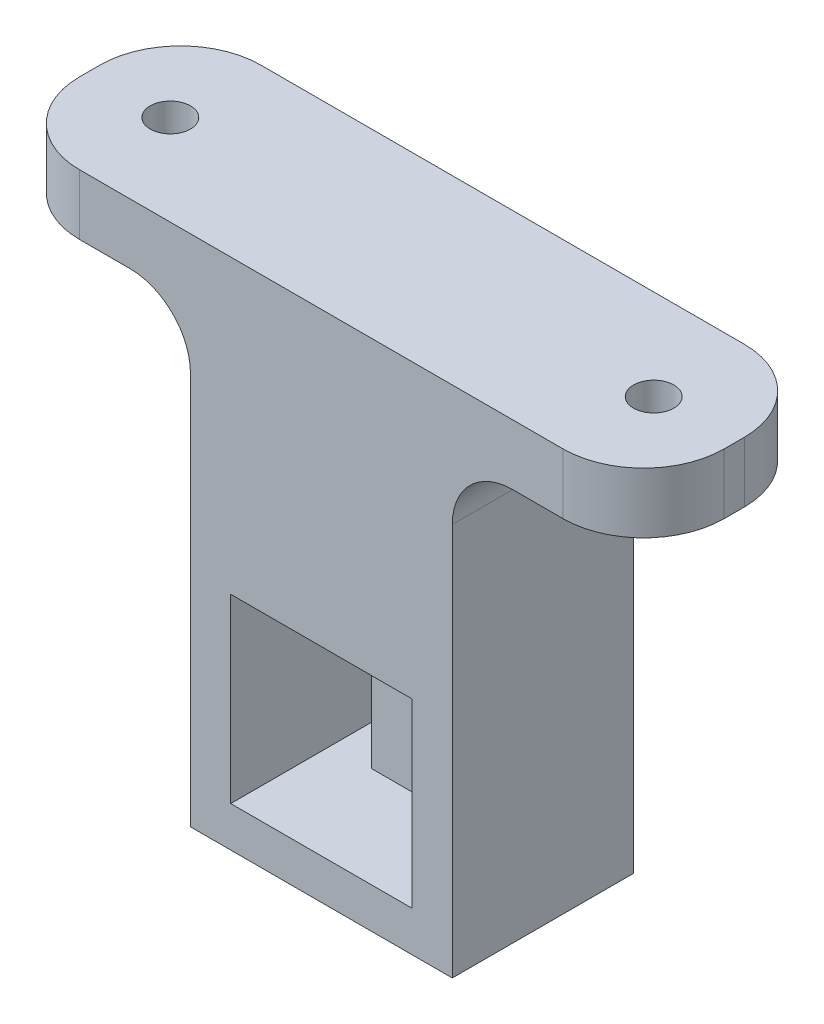
ISO-10303-21;
HEADER;
FILE_DESCRIPTION(('STEP AP214'),'2;1');
FILE_NAME('part.step','',(''),(''),'','','');
FILE_SCHEMA(('AUTOMOTIVE_DESIGN { 1 0 10303 214 1 1 1 1 }'));
ENDSEC;
DATA;
#1=APPLICATION_CONTEXT('core data for automotive mechanical design processes');
#2=APPLICATION_PROTOCOL_DEFINITION('international standard','automotive_design',2000,#1);
#3=PRODUCT_CONTEXT('',#1,'mechanical');
#4=PRODUCT('Part','Part','',(#3));
#5=PRODUCT_RELATED_PRODUCT_CATEGORY('part','',(#4));
#6=PRODUCT_DEFINITION_FORMATION('','',#4);
#7=PRODUCT_DEFINITION_CONTEXT('part definition',#1,'design');
#8=PRODUCT_DEFINITION('design','',#6,#7);
#9=PRODUCT_DEFINITION_SHAPE('','',#8);
#10=(LENGTH_UNIT() NAMED_UNIT(*) SI_UNIT(.MILLI.,.METRE.));
#11=(NAMED_UNIT(*) PLANE_ANGLE_UNIT() SI_UNIT($,.RADIAN.));
#12=(NAMED_UNIT(*) SI_UNIT($,.STERADIAN.) SOLID_ANGLE_UNIT());
#13=UNCERTAINTY_MEASURE_WITH_UNIT(LENGTH_MEASURE(1.E-05),#10,'distance_accuracy_value','');
#14=(GEOMETRIC_REPRESENTATION_CONTEXT(3) GLOBAL_UNCERTAINTY_ASSIGNED_CONTEXT((#13)) GLOBAL_UNIT_ASSIGNED_CONTEXT((#10,
#11,#12)) REPRESENTATION_CONTEXT('',''));
#15=CARTESIAN_POINT('',(0.,0.,0.));
#16=DIRECTION('',(0.,0.,1.));
#17=DIRECTION('',(1.,0.,0.));
#18=AXIS2_PLACEMENT_3D('',#15,#16,#17);
#19=CARTESIAN_POINT('',(-6.5,0.,-34.));
#20=DIRECTION('',(1.,0.,0.));
#21=DIRECTION('',(0.,1.,0.));
#22=AXIS2_PLACEMENT_3D('',#19,#20,#21);
#23=PLANE('',#22);
#24=DIRECTION('',(0.,-1.,0.));
#25=VECTOR('',#24,1.);
#26=CARTESIAN_POINT('',(-6.5,12.5,-25.));
#27=LINE('',#26,#25);
#28=CARTESIAN_POINT('',(-6.5,19.,-25.));
#29=VERTEX_POINT('',#28);
#30=CARTESIAN_POINT('',(-6.5,-0.499999999999999,-25.));
#31=VERTEX_POINT('',#30);
#32=EDGE_CURVE('E280',#29,#31,#27,.T.);
#33=ORIENTED_EDGE('',*,*,#32,.F.);
#34=DIRECTION('',(0.,0.,-1.));
#35=VECTOR('',#34,1.);
#36=CARTESIAN_POINT('',(-6.5,19.,-34.));
#37=LINE('',#36,#35);
#38=CARTESIAN_POINT('',(-6.5,19.,-34.));
#39=VERTEX_POINT('',#38);
#40=EDGE_CURVE('E349',#29,#39,#37,.T.);
#41=ORIENTED_EDGE('',*,*,#40,.T.);
#42=DIRECTION('',(0.,1.,0.));
#43=VECTOR('',#42,1.);
#44=CARTESIAN_POINT('',(-6.5,0.,-34.));
#45=LINE('',#44,#43);
#46=CARTESIAN_POINT('',(-6.5,-0.499999999999999,-34.));
#47=VERTEX_POINT('',#46);
#48=EDGE_CURVE('E315',#47,#39,#45,.T.);
#49=ORIENTED_EDGE('',*,*,#48,.F.);
#50=DIRECTION('',(0.,0.,1.));
#51=VECTOR('',#50,1.);
#52=CARTESIAN_POINT('',(-6.5,-0.499999999999999,-34.));
#53=LINE('',#52,#51);
#54=EDGE_CURVE('E325',#47,#31,#53,.T.);
#55=ORIENTED_EDGE('',*,*,#54,.T.);
#56=EDGE_LOOP('',(#33,#41,#49,#55));
#57=FACE_BOUND('',#56,.T.);
#58=ADVANCED_FACE('F37',(#57),#23,.F.);
#59=CARTESIAN_POINT('',(6.5,0.,-34.));
#60=DIRECTION('',(-1.,0.,0.));
#61=DIRECTION('',(0.,-1.,0.));
#62=AXIS2_PLACEMENT_3D('',#59,#60,#61);
#63=PLANE('',#62);
#64=DIRECTION('',(0.,-1.,0.));
#65=VECTOR('',#64,1.);
#66=CARTESIAN_POINT('',(6.5,0.,-34.));
#67=LINE('',#66,#65);
#68=CARTESIAN_POINT('',(6.5,19.,-34.));
#69=VERTEX_POINT('',#68);
#70=CARTESIAN_POINT('',(6.5,-0.499999999999999,-34.));
#71=VERTEX_POINT('',#70);
#72=EDGE_CURVE('E317',#69,#71,#67,.T.);
#73=ORIENTED_EDGE('',*,*,#72,.F.);
#74=DIRECTION('',(0.,0.,1.));
#75=VECTOR('',#74,1.);
#76=CARTESIAN_POINT('',(6.5,19.,-34.));
#77=LINE('',#76,#75);
#78=CARTESIAN_POINT('',(6.5,19.,-25.));
#79=VERTEX_POINT('',#78);
#80=EDGE_CURVE('E283',#69,#79,#77,.T.);
#81=ORIENTED_EDGE('',*,*,#80,.T.);
#82=DIRECTION('',(0.,1.,0.));
#83=VECTOR('',#82,1.);
#84=CARTESIAN_POINT('',(6.5,-0.499999999999999,-25.));
#85=LINE('',#84,#83);
#86=CARTESIAN_POINT('',(6.5,-0.499999999999999,-25.));
#87=VERTEX_POINT('',#86);
#88=EDGE_CURVE('E292',#87,#79,#85,.T.);
#89=ORIENTED_EDGE('',*,*,#88,.F.);
#90=DIRECTION('',(0.,0.,1.));
#91=VECTOR('',#90,1.);
#92=CARTESIAN_POINT('',(6.5,-0.499999999999999,-34.));
#93=LINE('',#92,#91);
#94=EDGE_CURVE('E287',#71,#87,#93,.T.);
#95=ORIENTED_EDGE('',*,*,#94,.F.);
#96=EDGE_LOOP('',(#73,#81,#89,#95));
#97=FACE_BOUND('',#96,.T.);
#98=ADVANCED_FACE('F361',(#97),#63,.F.);
#99=CARTESIAN_POINT('',(-2.5,0.,-34.));
#100=DIRECTION('',(1.,0.,0.));
#101=DIRECTION('',(0.,1.,0.));
#102=AXIS2_PLACEMENT_3D('',#99,#100,#101);
#103=PLANE('',#102);
#104=DIRECTION('',(0.,1.,0.));
#105=VECTOR('',#104,1.);
#106=CARTESIAN_POINT('',(-2.5,0.,-30.));
#107=LINE('',#106,#105);
#108=CARTESIAN_POINT('',(-2.5,1.5,-30.));
#109=VERTEX_POINT('',#108);
#110=CARTESIAN_POINT('',(-2.5,10.5,-30.));
#111=VERTEX_POINT('',#110);
#112=EDGE_CURVE('E300',#109,#111,#107,.T.);
#113=ORIENTED_EDGE('',*,*,#112,.T.);
#114=DIRECTION('',(0.,0.,1.));
#115=VECTOR('',#114,1.);
#116=CARTESIAN_POINT('',(-2.5,10.5,-34.));
#117=LINE('',#116,#115);
#118=CARTESIAN_POINT('',(-2.5,10.5,-34.));
#119=VERTEX_POINT('',#118);
#120=EDGE_CURVE('E328',#119,#111,#117,.T.);
#121=ORIENTED_EDGE('',*,*,#120,.F.);
#122=DIRECTION('',(0.,1.,0.));
#123=VECTOR('',#122,1.);
#124=CARTESIAN_POINT('',(-2.5,0.,-34.));
#125=LINE('',#124,#123);
#126=CARTESIAN_POINT('',(-2.5,1.5,-34.));
#127=VERTEX_POINT('',#126);
#128=EDGE_CURVE('E310',#127,#119,#125,.T.);
#129=ORIENTED_EDGE('',*,*,#128,.F.);
#130=DIRECTION('',(0.,0.,1.));
#131=VECTOR('',#130,1.);
#132=CARTESIAN_POINT('',(-2.5,1.5,-34.));
#133=LINE('',#132,#131);
#134=EDGE_CURVE('E330',#127,#109,#133,.T.);
#135=ORIENTED_EDGE('',*,*,#134,.T.);
#136=EDGE_LOOP('',(#113,#121,#129,#135));
#137=FACE_BOUND('',#136,.T.);
#138=ADVANCED_FACE('F415',(#137),#103,.F.);
#139=CARTESIAN_POINT('',(0.,10.5,-34.));
#140=DIRECTION('',(0.,-1.,0.));
#141=DIRECTION('',(0.,0.,-1.));
#142=AXIS2_PLACEMENT_3D('',#139,#140,#141);
#143=PLANE('',#142);
#144=ORIENTED_EDGE('',*,*,#120,.T.);
#145=DIRECTION('',(-1.,0.,0.));
#146=VECTOR('',#145,1.);
#147=CARTESIAN_POINT('',(4.5,10.5,-30.));
#148=LINE('',#147,#146);
#149=CARTESIAN_POINT('',(2.5,10.5,-30.));
#150=VERTEX_POINT('',#149);
#151=EDGE_CURVE('E281',#150,#111,#148,.T.);
#152=ORIENTED_EDGE('',*,*,#151,.F.);
#153=DIRECTION('',(0.,0.,1.));
#154=VECTOR('',#153,1.);
#155=CARTESIAN_POINT('',(2.5,10.5,-34.));
#156=LINE('',#155,#154);
#157=CARTESIAN_POINT('',(2.5,10.5,-34.));
#158=VERTEX_POINT('',#157);
#159=EDGE_CURVE('E333',#158,#150,#156,.T.);
#160=ORIENTED_EDGE('',*,*,#159,.F.);
#161=DIRECTION('',(1.,0.,0.));
#162=VECTOR('',#161,1.);
#163=CARTESIAN_POINT('',(0.,10.5,-34.));
#164=LINE('',#163,#162);
#165=CARTESIAN_POINT('',(4.5,10.5,-34.));
#166=VERTEX_POINT('',#165);
#167=EDGE_CURVE('E296',#158,#166,#164,.T.);
#168=ORIENTED_EDGE('',*,*,#167,.T.);
#169=DIRECTION('',(0.,0.,1.));
#170=VECTOR('',#169,1.);
#171=CARTESIAN_POINT('',(4.5,10.5,-34.));
#172=LINE('',#171,#170);
#173=CARTESIAN_POINT('',(4.5,10.5,-25.));
#174=VERTEX_POINT('',#173);
#175=EDGE_CURVE('E321',#166,#174,#172,.T.);
#176=ORIENTED_EDGE('',*,*,#175,.T.);
#177=DIRECTION('',(-1.,0.,0.));
#178=VECTOR('',#177,1.);
#179=CARTESIAN_POINT('',(4.5,10.5,-25.));
#180=LINE('',#179,#178);
#181=CARTESIAN_POINT('',(-4.5,10.5,-25.));
#182=VERTEX_POINT('',#181);
#183=EDGE_CURVE('E268',#174,#182,#180,.T.);
#184=ORIENTED_EDGE('',*,*,#183,.T.);
#185=DIRECTION('',(0.,0.,1.));
#186=VECTOR('',#185,1.);
#187=CARTESIAN_POINT('',(-4.5,10.5,-34.));
#188=LINE('',#187,#186);
#189=CARTESIAN_POINT('',(-4.5,10.5,-34.));
#190=VERTEX_POINT('',#189);
#191=EDGE_CURVE('E335',#190,#182,#188,.T.);
#192=ORIENTED_EDGE('',*,*,#191,.F.);
#193=EDGE_CURVE('E301',#190,#119,#164,.T.);
#194=ORIENTED_EDGE('',*,*,#193,.T.);
#195=EDGE_LOOP('',(#144,#152,#160,#168,#176,#184,#192,#194));
#196=FACE_BOUND('',#195,.T.);
#197=ADVANCED_FACE('F424',(#196),#143,.T.);
#198=CARTESIAN_POINT('',(-4.5,0.,-34.));
#199=DIRECTION('',(1.,0.,0.));
#200=DIRECTION('',(0.,0.,-1.));
#201=AXIS2_PLACEMENT_3D('',#198,#199,#200);
#202=PLANE('',#201);
#203=ORIENTED_EDGE('',*,*,#191,.T.);
#204=DIRECTION('',(0.,-1.,0.));
#205=VECTOR('',#204,1.);
#206=CARTESIAN_POINT('',(-4.5,10.5,-25.));
#207=LINE('',#206,#205);
#208=CARTESIAN_POINT('',(-4.5,1.5,-25.));
#209=VERTEX_POINT('',#208);
#210=EDGE_CURVE('E271',#182,#209,#207,.T.);
#211=ORIENTED_EDGE('',*,*,#210,.T.);
#212=DIRECTION('',(0.,0.,1.));
#213=VECTOR('',#212,1.);
#214=CARTESIAN_POINT('',(-4.5,1.5,-34.));
#215=LINE('',#214,#213);
#216=CARTESIAN_POINT('',(-4.5,1.5,-34.));
#217=VERTEX_POINT('',#216);
#218=EDGE_CURVE('E332',#217,#209,#215,.T.);
#219=ORIENTED_EDGE('',*,*,#218,.F.);
#220=DIRECTION('',(0.,1.,0.));
#221=VECTOR('',#220,1.);
#222=CARTESIAN_POINT('',(-4.5,0.,-34.));
#223=LINE('',#222,#221);
#224=EDGE_CURVE('E312',#217,#190,#223,.T.);
#225=ORIENTED_EDGE('',*,*,#224,.T.);
#226=EDGE_LOOP('',(#203,#211,#219,#225));
#227=FACE_BOUND('',#226,.T.);
#228=ADVANCED_FACE('F421',(#227),#202,.T.);
#229=CARTESIAN_POINT('',(2.5,0.,-34.));
#230=DIRECTION('',(-1.,0.,0.));
#231=DIRECTION('',(0.,-1.,0.));
#232=AXIS2_PLACEMENT_3D('',#229,#230,#231);
#233=PLANE('',#232);
#234=DIRECTION('',(0.,-1.,0.));
#235=VECTOR('',#234,1.);
#236=CARTESIAN_POINT('',(2.5,0.,-30.));
#237=LINE('',#236,#235);
#238=CARTESIAN_POINT('',(2.5,1.5,-30.));
#239=VERTEX_POINT('',#238);
#240=EDGE_CURVE('E295',#150,#239,#237,.T.);
#241=ORIENTED_EDGE('',*,*,#240,.T.);
#242=DIRECTION('',(0.,0.,1.));
#243=VECTOR('',#242,1.);
#244=CARTESIAN_POINT('',(2.5,1.5,-34.));
#245=LINE('',#244,#243);
#246=CARTESIAN_POINT('',(2.5,1.5,-34.));
#247=VERTEX_POINT('',#246);
#248=EDGE_CURVE('E342',#247,#239,#245,.T.);
#249=ORIENTED_EDGE('',*,*,#248,.F.);
#250=DIRECTION('',(0.,-1.,0.));
#251=VECTOR('',#250,1.);
#252=CARTESIAN_POINT('',(2.5,0.,-34.));
#253=LINE('',#252,#251);
#254=EDGE_CURVE('E299',#158,#247,#253,.T.);
#255=ORIENTED_EDGE('',*,*,#254,.F.);
#256=ORIENTED_EDGE('',*,*,#159,.T.);
#257=EDGE_LOOP('',(#241,#249,#255,#256));
#258=FACE_BOUND('',#257,.T.);
#259=ADVANCED_FACE('F419',(#258),#233,.F.);
#260=CARTESIAN_POINT('',(0.,1.5,-34.));
#261=DIRECTION('',(0.,1.,0.));
#262=DIRECTION('',(-1.,0.,0.));
#263=AXIS2_PLACEMENT_3D('',#260,#261,#262);
#264=PLANE('',#263);
#265=ORIENTED_EDGE('',*,*,#218,.T.);
#266=DIRECTION('',(1.,0.,0.));
#267=VECTOR('',#266,1.);
#268=CARTESIAN_POINT('',(-4.5,1.5,-25.));
#269=LINE('',#268,#267);
#270=CARTESIAN_POINT('',(4.5,1.5,-25.));
#271=VERTEX_POINT('',#270);
#272=EDGE_CURVE('E274',#209,#271,#269,.T.);
#273=ORIENTED_EDGE('',*,*,#272,.T.);
#274=DIRECTION('',(0.,0.,1.));
#275=VECTOR('',#274,1.);
#276=CARTESIAN_POINT('',(4.5,1.5,-34.));
#277=LINE('',#276,#275);
#278=CARTESIAN_POINT('',(4.5,1.5,-34.));
#279=VERTEX_POINT('',#278);
#280=EDGE_CURVE('E340',#279,#271,#277,.T.);
#281=ORIENTED_EDGE('',*,*,#280,.F.);
#282=DIRECTION('',(-1.,0.,0.));
#283=VECTOR('',#282,1.);
#284=CARTESIAN_POINT('',(0.,1.5,-34.));
#285=LINE('',#284,#283);
#286=EDGE_CURVE('E303',#279,#247,#285,.T.);
#287=ORIENTED_EDGE('',*,*,#286,.T.);
#288=ORIENTED_EDGE('',*,*,#248,.T.);
#289=DIRECTION('',(1.,0.,0.));
#290=VECTOR('',#289,1.);
#291=CARTESIAN_POINT('',(-4.5,1.5,-30.));
#292=LINE('',#291,#290);
#293=EDGE_CURVE('E284',#109,#239,#292,.T.);
#294=ORIENTED_EDGE('',*,*,#293,.F.);
#295=ORIENTED_EDGE('',*,*,#134,.F.);
#296=EDGE_CURVE('E307',#127,#217,#285,.T.);
#297=ORIENTED_EDGE('',*,*,#296,.T.);
#298=EDGE_LOOP('',(#265,#273,#281,#287,#288,#294,#295,#297));
#299=FACE_BOUND('',#298,.T.);
#300=ADVANCED_FACE('F405',(#299),#264,.T.);
#301=CARTESIAN_POINT('',(4.5,0.,-34.));
#302=DIRECTION('',(-1.,0.,0.));
#303=DIRECTION('',(0.,0.,1.));
#304=AXIS2_PLACEMENT_3D('',#301,#302,#303);
#305=PLANE('',#304);
#306=ORIENTED_EDGE('',*,*,#280,.T.);
#307=DIRECTION('',(0.,1.,0.));
#308=VECTOR('',#307,1.);
#309=CARTESIAN_POINT('',(4.5,1.5,-25.));
#310=LINE('',#309,#308);
#311=EDGE_CURVE('E277',#271,#174,#310,.T.);
#312=ORIENTED_EDGE('',*,*,#311,.T.);
#313=ORIENTED_EDGE('',*,*,#175,.F.);
#314=DIRECTION('',(0.,-1.,0.));
#315=VECTOR('',#314,1.);
#316=CARTESIAN_POINT('',(4.5,0.,-34.));
#317=LINE('',#316,#315);
#318=EDGE_CURVE('E306',#166,#279,#317,.T.);
#319=ORIENTED_EDGE('',*,*,#318,.T.);
#320=EDGE_LOOP('',(#306,#312,#313,#319));
#321=FACE_BOUND('',#320,.T.);
#322=ADVANCED_FACE('F397',(#321),#305,.T.);
#323=CARTESIAN_POINT('',(0.,-0.499999999999999,-34.));
#324=DIRECTION('',(0.,1.,0.));
#325=DIRECTION('',(0.,0.,1.));
#326=AXIS2_PLACEMENT_3D('',#323,#324,#325);
#327=PLANE('',#326);
#328=ORIENTED_EDGE('',*,*,#94,.T.);
#329=DIRECTION('',(1.,0.,0.));
#330=VECTOR('',#329,1.);
#331=CARTESIAN_POINT('',(-6.5,-0.499999999999999,-25.));
#332=LINE('',#331,#330);
#333=EDGE_CURVE('E289',#31,#87,#332,.T.);
#334=ORIENTED_EDGE('',*,*,#333,.F.);
#335=ORIENTED_EDGE('',*,*,#54,.F.);
#336=DIRECTION('',(-1.,0.,0.));
#337=VECTOR('',#336,1.);
#338=CARTESIAN_POINT('',(0.,-0.499999999999999,-34.));
#339=LINE('',#338,#337);
#340=EDGE_CURVE('E319',#71,#47,#339,.T.);
#341=ORIENTED_EDGE('',*,*,#340,.F.);
#342=EDGE_LOOP('',(#328,#334,#335,#341));
#343=FACE_BOUND('',#342,.T.);
#344=ADVANCED_FACE('F395',(#343),#327,.F.);
#345=CARTESIAN_POINT('',(0.,0.,-34.));
#346=DIRECTION('',(0.,0.,-1.));
#347=DIRECTION('',(-1.,0.,0.));
#348=AXIS2_PLACEMENT_3D('',#345,#346,#347);
#349=PLANE('',#348);
#350=ORIENTED_EDGE('',*,*,#48,.T.);
#351=CARTESIAN_POINT('',(-9.50000000000001,19.,-34.));
#352=DIRECTION('',(0.,0.,-1.));
#353=DIRECTION('',(-1.,0.,0.));
#354=AXIS2_PLACEMENT_3D('',#351,#352,#353);
#355=CIRCLE('',#354,3.);
#356=CARTESIAN_POINT('',(-9.50000000000001,22.,-34.));
#357=VERTEX_POINT('',#356);
#358=EDGE_CURVE('E45',#39,#357,#355,.F.);
#359=ORIENTED_EDGE('',*,*,#358,.T.);
#360=DIRECTION('',(-1.,0.,0.));
#361=VECTOR('',#360,1.);
#362=CARTESIAN_POINT('',(-12.,22.,-34.));
#363=LINE('',#362,#361);
#364=CARTESIAN_POINT('',(-12.,22.,-34.));
#365=VERTEX_POINT('',#364);
#366=EDGE_CURVE('E209',#357,#365,#363,.T.);
#367=ORIENTED_EDGE('',*,*,#366,.T.);
#368=DIRECTION('',(0.,1.,0.));
#369=VECTOR('',#368,1.);
#370=CARTESIAN_POINT('',(-12.,22.,-34.));
#371=LINE('',#370,#369);
#372=CARTESIAN_POINT('',(-12.,25.,-34.));
#373=VERTEX_POINT('',#372);
#374=EDGE_CURVE('E196',#365,#373,#371,.T.);
#375=ORIENTED_EDGE('',*,*,#374,.T.);
#376=DIRECTION('',(1.,0.,0.));
#377=VECTOR('',#376,1.);
#378=CARTESIAN_POINT('',(6.5,25.,-34.));
#379=LINE('',#378,#377);
#380=CARTESIAN_POINT('',(12.,25.,-34.));
#381=VERTEX_POINT('',#380);
#382=EDGE_CURVE('E191',#373,#381,#379,.T.);
#383=ORIENTED_EDGE('',*,*,#382,.T.);
#384=DIRECTION('',(0.,1.,0.));
#385=VECTOR('',#384,1.);
#386=CARTESIAN_POINT('',(12.,22.,-34.));
#387=LINE('',#386,#385);
#388=CARTESIAN_POINT('',(12.,22.,-34.));
#389=VERTEX_POINT('',#388);
#390=EDGE_CURVE('E184',#389,#381,#387,.T.);
#391=ORIENTED_EDGE('',*,*,#390,.F.);
#392=CARTESIAN_POINT('',(9.5,22.,-34.));
#393=VERTEX_POINT('',#392);
#394=EDGE_CURVE('E188',#389,#393,#363,.T.);
#395=ORIENTED_EDGE('',*,*,#394,.T.);
#396=CARTESIAN_POINT('',(9.5,19.,-34.));
#397=DIRECTION('',(0.,0.,-1.));
#398=DIRECTION('',(-1.,0.,0.));
#399=AXIS2_PLACEMENT_3D('',#396,#397,#398);
#400=CIRCLE('',#399,3.);
#401=EDGE_CURVE('E355',#393,#69,#400,.F.);
#402=ORIENTED_EDGE('',*,*,#401,.T.);
#403=ORIENTED_EDGE('',*,*,#72,.T.);
#404=ORIENTED_EDGE('',*,*,#340,.T.);
#405=EDGE_LOOP('',(#350,#359,#367,#375,#383,#391,#395,#402,#403,#404));
#406=FACE_BOUND('',#405,.T.);
#407=ORIENTED_EDGE('',*,*,#167,.F.);
#408=ORIENTED_EDGE('',*,*,#254,.T.);
#409=ORIENTED_EDGE('',*,*,#286,.F.);
#410=ORIENTED_EDGE('',*,*,#318,.F.);
#411=EDGE_LOOP('',(#407,#408,#409,#410));
#412=FACE_BOUND('',#411,.T.);
#413=ORIENTED_EDGE('',*,*,#128,.T.);
#414=ORIENTED_EDGE('',*,*,#193,.F.);
#415=ORIENTED_EDGE('',*,*,#224,.F.);
#416=ORIENTED_EDGE('',*,*,#296,.F.);
#417=EDGE_LOOP('',(#413,#414,#415,#416));
#418=FACE_BOUND('',#417,.T.);
#419=ADVANCED_FACE('F186',(#406,#412,#418),#349,.T.);
#420=CARTESIAN_POINT('',(0.,0.,-30.));
#421=DIRECTION('',(0.,0.,-1.));
#422=DIRECTION('',(-1.,0.,0.));
#423=AXIS2_PLACEMENT_3D('',#420,#421,#422);
#424=PLANE('',#423);
#425=ORIENTED_EDGE('',*,*,#240,.F.);
#426=ORIENTED_EDGE('',*,*,#151,.T.);
#427=ORIENTED_EDGE('',*,*,#112,.F.);
#428=ORIENTED_EDGE('',*,*,#293,.T.);
#429=EDGE_LOOP('',(#425,#426,#427,#428));
#430=FACE_BOUND('',#429,.T.);
#431=ADVANCED_FACE('F403',(#430),#424,.F.);
#432=CARTESIAN_POINT('',(0.,0.,-25.));
#433=DIRECTION('',(0.,0.,1.));
#434=DIRECTION('',(1.,0.,0.));
#435=AXIS2_PLACEMENT_3D('',#432,#433,#434);
#436=PLANE('',#435);
#437=ORIENTED_EDGE('',*,*,#88,.T.);
#438=CARTESIAN_POINT('',(9.5,19.,-25.));
#439=DIRECTION('',(0.,0.,1.));
#440=DIRECTION('',(1.,0.,0.));
#441=AXIS2_PLACEMENT_3D('',#438,#439,#440);
#442=CIRCLE('',#441,3.);
#443=CARTESIAN_POINT('',(9.5,22.,-25.));
#444=VERTEX_POINT('',#443);
#445=EDGE_CURVE('E353',#79,#444,#442,.F.);
#446=ORIENTED_EDGE('',*,*,#445,.T.);
#447=DIRECTION('',(1.,0.,0.));
#448=VECTOR('',#447,1.);
#449=CARTESIAN_POINT('',(-12.,22.,-25.));
#450=LINE('',#449,#448);
#451=CARTESIAN_POINT('',(12.,22.,-25.));
#452=VERTEX_POINT('',#451);
#453=EDGE_CURVE('E230',#444,#452,#450,.T.);
#454=ORIENTED_EDGE('',*,*,#453,.T.);
#455=DIRECTION('',(0.,1.,0.));
#456=VECTOR('',#455,1.);
#457=CARTESIAN_POINT('',(12.,22.,-25.));
#458=LINE('',#457,#456);
#459=CARTESIAN_POINT('',(12.,25.,-25.));
#460=VERTEX_POINT('',#459);
#461=EDGE_CURVE('E255',#452,#460,#458,.T.);
#462=ORIENTED_EDGE('',*,*,#461,.T.);
#463=DIRECTION('',(-1.,0.,0.));
#464=VECTOR('',#463,1.);
#465=CARTESIAN_POINT('',(-6.5,25.,-25.));
#466=LINE('',#465,#464);
#467=CARTESIAN_POINT('',(-12.,25.,-25.));
#468=VERTEX_POINT('',#467);
#469=EDGE_CURVE('E252',#460,#468,#466,.T.);
#470=ORIENTED_EDGE('',*,*,#469,.T.);
#471=DIRECTION('',(0.,1.,0.));
#472=VECTOR('',#471,1.);
#473=CARTESIAN_POINT('',(-12.,22.,-25.));
#474=LINE('',#473,#472);
#475=CARTESIAN_POINT('',(-12.,22.,-25.));
#476=VERTEX_POINT('',#475);
#477=EDGE_CURVE('E258',#476,#468,#474,.T.);
#478=ORIENTED_EDGE('',*,*,#477,.F.);
#479=CARTESIAN_POINT('',(-9.50000000000001,22.,-25.));
#480=VERTEX_POINT('',#479);
#481=EDGE_CURVE('E231',#476,#480,#450,.T.);
#482=ORIENTED_EDGE('',*,*,#481,.T.);
#483=CARTESIAN_POINT('',(-9.50000000000001,19.,-25.));
#484=DIRECTION('',(0.,0.,1.));
#485=DIRECTION('',(1.,0.,0.));
#486=AXIS2_PLACEMENT_3D('',#483,#484,#485);
#487=CIRCLE('',#486,3.);
#488=EDGE_CURVE('E11',#480,#29,#487,.F.);
#489=ORIENTED_EDGE('',*,*,#488,.T.);
#490=ORIENTED_EDGE('',*,*,#32,.T.);
#491=ORIENTED_EDGE('',*,*,#333,.T.);
#492=EDGE_LOOP('',(#437,#446,#454,#462,#470,#478,#482,#489,#490,#491));
#493=FACE_BOUND('',#492,.T.);
#494=ORIENTED_EDGE('',*,*,#210,.F.);
#495=ORIENTED_EDGE('',*,*,#183,.F.);
#496=ORIENTED_EDGE('',*,*,#311,.F.);
#497=ORIENTED_EDGE('',*,*,#272,.F.);
#498=EDGE_LOOP('',(#494,#495,#496,#497));
#499=FACE_BOUND('',#498,.T.);
#500=ADVANCED_FACE('F366',(#493,#499),#436,.T.);
#501=CARTESIAN_POINT('',(0.,25.,0.));
#502=DIRECTION('',(0.,-1.,0.));
#503=DIRECTION('',(1.,0.,0.));
#504=AXIS2_PLACEMENT_3D('',#501,#502,#503);
#505=PLANE('',#504);
#506=CARTESIAN_POINT('',(-12.,25.,-29.5));
#507=DIRECTION('',(0.,-1.,0.));
#508=DIRECTION('',(1.,0.,0.));
#509=AXIS2_PLACEMENT_3D('',#506,#507,#508);
#510=CIRCLE('',#509,1.);
#511=CARTESIAN_POINT('',(-11.,25.,-29.5));
#512=VERTEX_POINT('',#511);
#513=EDGE_CURVE('E240',#512,#512,#510,.T.);
#514=ORIENTED_EDGE('',*,*,#513,.T.);
#515=EDGE_LOOP('',(#514));
#516=FACE_BOUND('',#515,.T.);
#517=CARTESIAN_POINT('',(12.,25.,-29.5));
#518=DIRECTION('',(0.,-1.,0.));
#519=DIRECTION('',(1.,0.,0.));
#520=AXIS2_PLACEMENT_3D('',#517,#518,#519);
#521=CIRCLE('',#520,1.);
#522=CARTESIAN_POINT('',(13.,25.,-29.5));
#523=VERTEX_POINT('',#522);
#524=EDGE_CURVE('E726',#523,#523,#521,.T.);
#525=ORIENTED_EDGE('',*,*,#524,.T.);
#526=EDGE_LOOP('',(#525));
#527=FACE_BOUND('',#526,.T.);
#528=ORIENTED_EDGE('',*,*,#382,.F.);
#529=CARTESIAN_POINT('',(-12.,25.,-30.));
#530=DIRECTION('',(0.,1.,0.));
#531=DIRECTION('',(1.,0.,0.));
#532=AXIS2_PLACEMENT_3D('',#529,#530,#531);
#533=CIRCLE('',#532,4.);
#534=CARTESIAN_POINT('',(-16.,25.,-30.));
#535=VERTEX_POINT('',#534);
#536=EDGE_CURVE('E239',#373,#535,#533,.T.);
#537=ORIENTED_EDGE('',*,*,#536,.T.);
#538=DIRECTION('',(0.,0.,1.));
#539=VECTOR('',#538,1.);
#540=CARTESIAN_POINT('',(-16.,25.,-29.));
#541=LINE('',#540,#539);
#542=CARTESIAN_POINT('',(-16.,25.,-29.));
#543=VERTEX_POINT('',#542);
#544=EDGE_CURVE('E243',#535,#543,#541,.T.);
#545=ORIENTED_EDGE('',*,*,#544,.T.);
#546=CARTESIAN_POINT('',(-12.,25.,-29.));
#547=DIRECTION('',(0.,1.,0.));
#548=DIRECTION('',(1.,0.,0.));
#549=AXIS2_PLACEMENT_3D('',#546,#547,#548);
#550=CIRCLE('',#549,4.);
#551=EDGE_CURVE('E246',#543,#468,#550,.T.);
#552=ORIENTED_EDGE('',*,*,#551,.T.);
#553=ORIENTED_EDGE('',*,*,#469,.F.);
#554=CARTESIAN_POINT('',(12.,25.,-29.));
#555=DIRECTION('',(0.,1.,0.));
#556=DIRECTION('',(-1.,0.,0.));
#557=AXIS2_PLACEMENT_3D('',#554,#555,#556);
#558=CIRCLE('',#557,4.);
#559=CARTESIAN_POINT('',(16.,25.,-29.));
#560=VERTEX_POINT('',#559);
#561=EDGE_CURVE('E216',#460,#560,#558,.T.);
#562=ORIENTED_EDGE('',*,*,#561,.T.);
#563=DIRECTION('',(0.,0.,-1.));
#564=VECTOR('',#563,1.);
#565=CARTESIAN_POINT('',(16.,25.,-29.));
#566=LINE('',#565,#564);
#567=CARTESIAN_POINT('',(16.,25.,-30.));
#568=VERTEX_POINT('',#567);
#569=EDGE_CURVE('E213',#560,#568,#566,.T.);
#570=ORIENTED_EDGE('',*,*,#569,.T.);
#571=CARTESIAN_POINT('',(12.,25.,-30.));
#572=DIRECTION('',(0.,1.,0.));
#573=DIRECTION('',(1.,0.,0.));
#574=AXIS2_PLACEMENT_3D('',#571,#572,#573);
#575=CIRCLE('',#574,4.);
#576=EDGE_CURVE('E237',#568,#381,#575,.T.);
#577=ORIENTED_EDGE('',*,*,#576,.T.);
#578=EDGE_LOOP('',(#528,#537,#545,#552,#553,#562,#570,#577));
#579=FACE_BOUND('',#578,.T.);
#580=ADVANCED_FACE('F378',(#516,#527,#579),#505,.F.);
#581=CARTESIAN_POINT('',(12.,22.,-30.));
#582=DIRECTION('',(0.,1.,0.));
#583=DIRECTION('',(-1.,0.,0.));
#584=AXIS2_PLACEMENT_3D('',#581,#582,#583);
#585=CYLINDRICAL_SURFACE('',#584,4.);
#586=ORIENTED_EDGE('',*,*,#576,.F.);
#587=DIRECTION('',(0.,1.,0.));
#588=VECTOR('',#587,1.);
#589=CARTESIAN_POINT('',(16.,22.,-30.));
#590=LINE('',#589,#588);
#591=CARTESIAN_POINT('',(16.,22.,-30.));
#592=VERTEX_POINT('',#591);
#593=EDGE_CURVE('E212',#592,#568,#590,.T.);
#594=ORIENTED_EDGE('',*,*,#593,.F.);
#595=CARTESIAN_POINT('',(12.,22.,-30.));
#596=DIRECTION('',(0.,1.,0.));
#597=DIRECTION('',(1.,0.,0.));
#598=AXIS2_PLACEMENT_3D('',#595,#596,#597);
#599=CIRCLE('',#598,4.);
#600=EDGE_CURVE('E204',#592,#389,#599,.T.);
#601=ORIENTED_EDGE('',*,*,#600,.T.);
#602=ORIENTED_EDGE('',*,*,#390,.T.);
#603=EDGE_LOOP('',(#586,#594,#601,#602));
#604=FACE_BOUND('',#603,.T.);
#605=ADVANCED_FACE('F211',(#604),#585,.T.);
#606=CARTESIAN_POINT('',(16.,22.,-29.));
#607=DIRECTION('',(1.,0.,0.));
#608=DIRECTION('',(0.,1.,0.));
#609=AXIS2_PLACEMENT_3D('',#606,#607,#608);
#610=PLANE('',#609);
#611=ORIENTED_EDGE('',*,*,#569,.F.);
#612=DIRECTION('',(0.,1.,0.));
#613=VECTOR('',#612,1.);
#614=CARTESIAN_POINT('',(16.,22.,-29.));
#615=LINE('',#614,#613);
#616=CARTESIAN_POINT('',(16.,22.,-29.));
#617=VERTEX_POINT('',#616);
#618=EDGE_CURVE('E253',#617,#560,#615,.T.);
#619=ORIENTED_EDGE('',*,*,#618,.F.);
#620=DIRECTION('',(0.,0.,-1.));
#621=VECTOR('',#620,1.);
#622=CARTESIAN_POINT('',(16.,22.,-29.));
#623=LINE('',#622,#621);
#624=EDGE_CURVE('E197',#617,#592,#623,.T.);
#625=ORIENTED_EDGE('',*,*,#624,.T.);
#626=ORIENTED_EDGE('',*,*,#593,.T.);
#627=EDGE_LOOP('',(#611,#619,#625,#626));
#628=FACE_BOUND('',#627,.T.);
#629=ADVANCED_FACE('F451',(#628),#610,.T.);
#630=CARTESIAN_POINT('',(12.,22.,-29.));
#631=DIRECTION('',(0.,1.,0.));
#632=DIRECTION('',(-1.,0.,0.));
#633=AXIS2_PLACEMENT_3D('',#630,#631,#632);
#634=CYLINDRICAL_SURFACE('',#633,4.);
#635=ORIENTED_EDGE('',*,*,#561,.F.);
#636=ORIENTED_EDGE('',*,*,#461,.F.);
#637=CARTESIAN_POINT('',(12.,22.,-29.));
#638=DIRECTION('',(0.,1.,0.));
#639=DIRECTION('',(-1.,0.,0.));
#640=AXIS2_PLACEMENT_3D('',#637,#638,#639);
#641=CIRCLE('',#640,4.);
#642=EDGE_CURVE('E233',#452,#617,#641,.T.);
#643=ORIENTED_EDGE('',*,*,#642,.T.);
#644=ORIENTED_EDGE('',*,*,#618,.T.);
#645=EDGE_LOOP('',(#635,#636,#643,#644));
#646=FACE_BOUND('',#645,.T.);
#647=ADVANCED_FACE('F372',(#646),#634,.T.);
#648=CARTESIAN_POINT('',(12.,22.,-30.));
#649=DIRECTION('',(0.,-1.,0.));
#650=DIRECTION('',(1.,0.,0.));
#651=AXIS2_PLACEMENT_3D('',#648,#649,#650);
#652=PLANE('',#651);
#653=CARTESIAN_POINT('',(12.,22.,-29.5));
#654=DIRECTION('',(0.,-1.,0.));
#655=DIRECTION('',(1.,0.,0.));
#656=AXIS2_PLACEMENT_3D('',#653,#654,#655);
#657=CIRCLE('',#656,1.);
#658=CARTESIAN_POINT('',(13.,22.,-29.5));
#659=VERTEX_POINT('',#658);
#660=EDGE_CURVE('E219',#659,#659,#657,.T.);
#661=ORIENTED_EDGE('',*,*,#660,.F.);
#662=EDGE_LOOP('',(#661));
#663=FACE_BOUND('',#662,.T.);
#664=ORIENTED_EDGE('',*,*,#453,.F.);
#665=DIRECTION('',(0.,0.,1.));
#666=VECTOR('',#665,1.);
#667=CARTESIAN_POINT('',(9.5,22.,-30.));
#668=LINE('',#667,#666);
#669=EDGE_CURVE('E207',#444,#393,#668,.F.);
#670=ORIENTED_EDGE('',*,*,#669,.T.);
#671=ORIENTED_EDGE('',*,*,#394,.F.);
#672=ORIENTED_EDGE('',*,*,#600,.F.);
#673=ORIENTED_EDGE('',*,*,#624,.F.);
#674=ORIENTED_EDGE('',*,*,#642,.F.);
#675=EDGE_LOOP('',(#664,#670,#671,#672,#673,#674));
#676=FACE_BOUND('',#675,.T.);
#677=ADVANCED_FACE('F202',(#663,#676),#652,.T.);
#678=CARTESIAN_POINT('',(-12.,22.,-29.5));
#679=DIRECTION('',(0.,-1.,0.));
#680=DIRECTION('',(1.,0.,0.));
#681=AXIS2_PLACEMENT_3D('',#678,#679,#680);
#682=CIRCLE('',#681,1.);
#683=CARTESIAN_POINT('',(-11.,22.,-29.5));
#684=VERTEX_POINT('',#683);
#685=EDGE_CURVE('E729',#684,#684,#682,.T.);
#686=ORIENTED_EDGE('',*,*,#685,.F.);
#687=EDGE_LOOP('',(#686));
#688=FACE_BOUND('',#687,.T.);
#689=ORIENTED_EDGE('',*,*,#366,.F.);
#690=DIRECTION('',(0.,0.,-1.));
#691=VECTOR('',#690,1.);
#692=CARTESIAN_POINT('',(-9.50000000000001,22.,-30.));
#693=LINE('',#692,#691);
#694=EDGE_CURVE('E58',#357,#480,#693,.F.);
#695=ORIENTED_EDGE('',*,*,#694,.T.);
#696=ORIENTED_EDGE('',*,*,#481,.F.);
#697=CARTESIAN_POINT('',(-12.,22.,-29.));
#698=DIRECTION('',(0.,1.,0.));
#699=DIRECTION('',(1.,0.,0.));
#700=AXIS2_PLACEMENT_3D('',#697,#698,#699);
#701=CIRCLE('',#700,4.);
#702=CARTESIAN_POINT('',(-16.,22.,-29.));
#703=VERTEX_POINT('',#702);
#704=EDGE_CURVE('E227',#703,#476,#701,.T.);
#705=ORIENTED_EDGE('',*,*,#704,.F.);
#706=DIRECTION('',(0.,0.,1.));
#707=VECTOR('',#706,1.);
#708=CARTESIAN_POINT('',(-16.,22.,-29.));
#709=LINE('',#708,#707);
#710=CARTESIAN_POINT('',(-16.,22.,-30.));
#711=VERTEX_POINT('',#710);
#712=EDGE_CURVE('E224',#711,#703,#709,.T.);
#713=ORIENTED_EDGE('',*,*,#712,.F.);
#714=CARTESIAN_POINT('',(-12.,22.,-30.));
#715=DIRECTION('',(0.,1.,0.));
#716=DIRECTION('',(1.,0.,0.));
#717=AXIS2_PLACEMENT_3D('',#714,#715,#716);
#718=CIRCLE('',#717,4.);
#719=EDGE_CURVE('E208',#365,#711,#718,.T.);
#720=ORIENTED_EDGE('',*,*,#719,.F.);
#721=EDGE_LOOP('',(#689,#695,#696,#705,#713,#720));
#722=FACE_BOUND('',#721,.T.);
#723=ADVANCED_FACE('F384',(#688,#722),#652,.T.);
#724=CARTESIAN_POINT('',(-12.,22.,-29.));
#725=DIRECTION('',(0.,1.,0.));
#726=DIRECTION('',(-1.,0.,0.));
#727=AXIS2_PLACEMENT_3D('',#724,#725,#726);
#728=CYLINDRICAL_SURFACE('',#727,4.);
#729=ORIENTED_EDGE('',*,*,#551,.F.);
#730=DIRECTION('',(0.,1.,0.));
#731=VECTOR('',#730,1.);
#732=CARTESIAN_POINT('',(-16.,22.,-29.));
#733=LINE('',#732,#731);
#734=EDGE_CURVE('E261',#703,#543,#733,.T.);
#735=ORIENTED_EDGE('',*,*,#734,.F.);
#736=ORIENTED_EDGE('',*,*,#704,.T.);
#737=ORIENTED_EDGE('',*,*,#477,.T.);
#738=EDGE_LOOP('',(#729,#735,#736,#737));
#739=FACE_BOUND('',#738,.T.);
#740=ADVANCED_FACE('F376',(#739),#728,.T.);
#741=CARTESIAN_POINT('',(-16.,22.,-29.));
#742=DIRECTION('',(-1.,0.,0.));
#743=DIRECTION('',(0.,-1.,0.));
#744=AXIS2_PLACEMENT_3D('',#741,#742,#743);
#745=PLANE('',#744);
#746=ORIENTED_EDGE('',*,*,#544,.F.);
#747=DIRECTION('',(0.,1.,0.));
#748=VECTOR('',#747,1.);
#749=CARTESIAN_POINT('',(-16.,22.,-30.));
#750=LINE('',#749,#748);
#751=EDGE_CURVE('E263',#711,#535,#750,.T.);
#752=ORIENTED_EDGE('',*,*,#751,.F.);
#753=ORIENTED_EDGE('',*,*,#712,.T.);
#754=ORIENTED_EDGE('',*,*,#734,.T.);
#755=EDGE_LOOP('',(#746,#752,#753,#754));
#756=FACE_BOUND('',#755,.T.);
#757=ADVANCED_FACE('F382',(#756),#745,.T.);
#758=CARTESIAN_POINT('',(-12.,22.,-30.));
#759=DIRECTION('',(0.,1.,0.));
#760=DIRECTION('',(-1.,0.,0.));
#761=AXIS2_PLACEMENT_3D('',#758,#759,#760);
#762=CYLINDRICAL_SURFACE('',#761,4.);
#763=ORIENTED_EDGE('',*,*,#536,.F.);
#764=ORIENTED_EDGE('',*,*,#374,.F.);
#765=ORIENTED_EDGE('',*,*,#719,.T.);
#766=ORIENTED_EDGE('',*,*,#751,.T.);
#767=EDGE_LOOP('',(#763,#764,#765,#766));
#768=FACE_BOUND('',#767,.T.);
#769=ADVANCED_FACE('F435',(#768),#762,.T.);
#770=CARTESIAN_POINT('',(9.5,19.,-34.));
#771=DIRECTION('',(0.,0.,1.));
#772=DIRECTION('',(1.,0.,0.));
#773=AXIS2_PLACEMENT_3D('',#770,#771,#772);
#774=CYLINDRICAL_SURFACE('',#773,3.);
#775=ORIENTED_EDGE('',*,*,#401,.F.);
#776=ORIENTED_EDGE('',*,*,#669,.F.);
#777=ORIENTED_EDGE('',*,*,#445,.F.);
#778=ORIENTED_EDGE('',*,*,#80,.F.);
#779=EDGE_LOOP('',(#775,#776,#777,#778));
#780=FACE_BOUND('',#779,.T.);
#781=ADVANCED_FACE('F364',(#780),#774,.F.);
#782=CARTESIAN_POINT('',(-9.50000000000001,19.,-34.));
#783=DIRECTION('',(0.,0.,-1.));
#784=DIRECTION('',(-1.,0.,0.));
#785=AXIS2_PLACEMENT_3D('',#782,#783,#784);
#786=CYLINDRICAL_SURFACE('',#785,3.);
#787=ORIENTED_EDGE('',*,*,#488,.F.);
#788=ORIENTED_EDGE('',*,*,#694,.F.);
#789=ORIENTED_EDGE('',*,*,#358,.F.);
#790=ORIENTED_EDGE('',*,*,#40,.F.);
#791=EDGE_LOOP('',(#787,#788,#789,#790));
#792=FACE_BOUND('',#791,.T.);
#793=ADVANCED_FACE('F39',(#792),#786,.F.);
#794=CARTESIAN_POINT('',(-12.,25.,-29.5));
#795=DIRECTION('',(0.,-1.,0.));
#796=DIRECTION('',(1.,0.,0.));
#797=AXIS2_PLACEMENT_3D('',#794,#795,#796);
#798=CYLINDRICAL_SURFACE('',#797,1.);
#799=ORIENTED_EDGE('',*,*,#513,.F.);
#800=EDGE_LOOP('',(#799));
#801=FACE_BOUND('',#800,.T.);
#802=ORIENTED_EDGE('',*,*,#685,.T.);
#803=EDGE_LOOP('',(#802));
#804=FACE_BOUND('',#803,.T.);
#805=ADVANCED_FACE('F440',(#801,#804),#798,.F.);
#806=CARTESIAN_POINT('',(12.,25.,-29.5));
#807=DIRECTION('',(0.,-1.,0.));
#808=DIRECTION('',(1.,0.,0.));
#809=AXIS2_PLACEMENT_3D('',#806,#807,#808);
#810=CYLINDRICAL_SURFACE('',#809,1.);
#811=ORIENTED_EDGE('',*,*,#524,.F.);
#812=EDGE_LOOP('',(#811));
#813=FACE_BOUND('',#812,.T.);
#814=ORIENTED_EDGE('',*,*,#660,.T.);
#815=EDGE_LOOP('',(#814));
#816=FACE_BOUND('',#815,.T.);
#817=ADVANCED_FACE('F709',(#813,#816),#810,.F.);
#818=CLOSED_SHELL('',(#58,#98,#138,#197,#228,#259,#300,#322,#344,#419,#431,#500,#580,#605,#629,
#647,#677,#723,#740,#757,#769,#781,#793,#805,#817));
#819=MANIFOLD_SOLID_BREP('B2',#818);
#820=ADVANCED_BREP_SHAPE_REPRESENTATION('',(#18,#819),#14);
#821=SHAPE_DEFINITION_REPRESENTATION(#9,#820);
ENDSEC;
END-ISO-10303-21;
